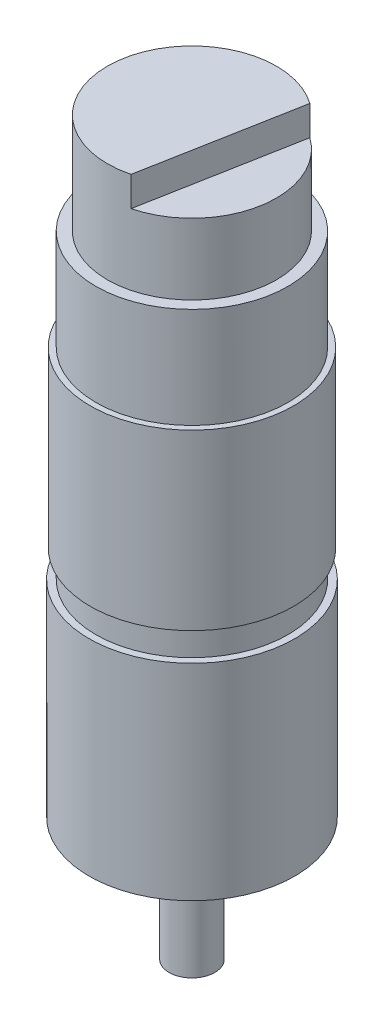
ISO-10303-21;
HEADER;
FILE_DESCRIPTION(('STEP AP214'),'2;1');
FILE_NAME('part.step','',(''),(''),'','','');
FILE_SCHEMA(('AUTOMOTIVE_DESIGN { 1 0 10303 214 1 1 1 1 }'));
ENDSEC;
DATA;
#1=APPLICATION_CONTEXT('core data for automotive mechanical design processes');
#2=APPLICATION_PROTOCOL_DEFINITION('international standard','automotive_design',2000,#1);
#3=PRODUCT_CONTEXT('',#1,'mechanical');
#4=PRODUCT('Part','Part','',(#3));
#5=PRODUCT_RELATED_PRODUCT_CATEGORY('part','',(#4));
#6=PRODUCT_DEFINITION_FORMATION('','',#4);
#7=PRODUCT_DEFINITION_CONTEXT('part definition',#1,'design');
#8=PRODUCT_DEFINITION('design','',#6,#7);
#9=PRODUCT_DEFINITION_SHAPE('','',#8);
#10=(LENGTH_UNIT() NAMED_UNIT(*) SI_UNIT(.MILLI.,.METRE.));
#11=(NAMED_UNIT(*) PLANE_ANGLE_UNIT() SI_UNIT($,.RADIAN.));
#12=(NAMED_UNIT(*) SI_UNIT($,.STERADIAN.) SOLID_ANGLE_UNIT());
#13=UNCERTAINTY_MEASURE_WITH_UNIT(LENGTH_MEASURE(1.E-05),#10,'distance_accuracy_value','');
#14=(GEOMETRIC_REPRESENTATION_CONTEXT(3) GLOBAL_UNCERTAINTY_ASSIGNED_CONTEXT((#13)) GLOBAL_UNIT_ASSIGNED_CONTEXT((#10,
#11,#12)) REPRESENTATION_CONTEXT('',''));
#15=CARTESIAN_POINT('',(0.,0.,0.));
#16=DIRECTION('',(0.,0.,1.));
#17=DIRECTION('',(1.,0.,0.));
#18=AXIS2_PLACEMENT_3D('',#15,#16,#17);
#19=CARTESIAN_POINT('',(0.,-2.,-49.6414213562373));
#20=DIRECTION('',(0.,-1.,0.));
#21=DIRECTION('',(0.,0.,-1.));
#22=AXIS2_PLACEMENT_3D('',#19,#20,#21);
#23=PLANE('',#22);
#24=DIRECTION('',(1.,0.,0.));
#25=VECTOR('',#24,1.);
#26=CARTESIAN_POINT('',(0.,-2.,-12.));
#27=LINE('',#26,#25);
#28=CARTESIAN_POINT('',(-5.00000000000001,-2.,-12.));
#29=VERTEX_POINT('',#28);
#30=CARTESIAN_POINT('',(5.00000000000001,-2.,-12.));
#31=VERTEX_POINT('',#30);
#32=EDGE_CURVE('E124',#29,#31,#27,.T.);
#33=ORIENTED_EDGE('',*,*,#32,.T.);
#34=CARTESIAN_POINT('',(0.,-2.,0.));
#35=DIRECTION('',(0.,-1.,0.));
#36=DIRECTION('',(0.,0.,-1.));
#37=AXIS2_PLACEMENT_3D('',#34,#35,#36);
#38=CIRCLE('',#37,13.);
#39=CARTESIAN_POINT('',(5.00000000000001,-2.,12.));
#40=VERTEX_POINT('',#39);
#41=EDGE_CURVE('E113',#31,#40,#38,.T.);
#42=ORIENTED_EDGE('',*,*,#41,.T.);
#43=DIRECTION('',(1.,0.,0.));
#44=VECTOR('',#43,1.);
#45=CARTESIAN_POINT('',(0.,-2.,12.));
#46=LINE('',#45,#44);
#47=CARTESIAN_POINT('',(-5.00000000000001,-2.,12.));
#48=VERTEX_POINT('',#47);
#49=EDGE_CURVE('E123',#48,#40,#46,.T.);
#50=ORIENTED_EDGE('',*,*,#49,.F.);
#51=EDGE_CURVE('E126',#48,#29,#38,.T.);
#52=ORIENTED_EDGE('',*,*,#51,.T.);
#53=EDGE_LOOP('',(#33,#42,#50,#52));
#54=FACE_BOUND('',#53,.T.);
#55=CARTESIAN_POINT('',(0.,-2.,0.));
#56=DIRECTION('',(0.,-1.,0.));
#57=DIRECTION('',(0.,0.,-1.));
#58=AXIS2_PLACEMENT_3D('',#55,#56,#57);
#59=CIRCLE('',#58,5.);
#60=CARTESIAN_POINT('',(0.,-2.,-5.));
#61=VERTEX_POINT('',#60);
#62=EDGE_CURVE('E557',#61,#61,#59,.T.);
#63=ORIENTED_EDGE('',*,*,#62,.F.);
#64=EDGE_LOOP('',(#63));
#65=FACE_BOUND('',#64,.T.);
#66=ADVANCED_FACE('F38',(#54,#65),#23,.T.);
#67=CARTESIAN_POINT('',(0.,0.,0.));
#68=DIRECTION('',(0.,1.,0.));
#69=DIRECTION('',(0.,0.,1.));
#70=AXIS2_PLACEMENT_3D('',#67,#68,#69);
#71=PLANE('',#70);
#72=CARTESIAN_POINT('',(-12.5779890005447,0.,-12.1673412339005));
#73=DIRECTION('',(0.,-1.,0.));
#74=DIRECTION('',(0.,0.,-1.));
#75=AXIS2_PLACEMENT_3D('',#72,#73,#74);
#76=CIRCLE('',#75,2.);
#77=CARTESIAN_POINT('',(-12.5779890005447,0.,-14.1673412339005));
#78=VERTEX_POINT('',#77);
#79=EDGE_CURVE('E537',#78,#78,#76,.T.);
#80=ORIENTED_EDGE('',*,*,#79,.F.);
#81=EDGE_LOOP('',(#80));
#82=FACE_BOUND('',#81,.T.);
#83=CARTESIAN_POINT('',(-12.5779890005447,0.,12.1673412339006));
#84=DIRECTION('',(0.,-1.,0.));
#85=DIRECTION('',(0.,0.,-1.));
#86=AXIS2_PLACEMENT_3D('',#83,#84,#85);
#87=CIRCLE('',#86,2.);
#88=CARTESIAN_POINT('',(-12.5779890005447,0.,10.1673412339006));
#89=VERTEX_POINT('',#88);
#90=EDGE_CURVE('E536',#89,#89,#87,.T.);
#91=ORIENTED_EDGE('',*,*,#90,.F.);
#92=EDGE_LOOP('',(#91));
#93=FACE_BOUND('',#92,.T.);
#94=CARTESIAN_POINT('',(12.5779890005447,0.,12.1673412339006));
#95=DIRECTION('',(0.,-1.,0.));
#96=DIRECTION('',(0.,0.,-1.));
#97=AXIS2_PLACEMENT_3D('',#94,#95,#96);
#98=CIRCLE('',#97,2.);
#99=CARTESIAN_POINT('',(12.5779890005447,0.,10.1673412339006));
#100=VERTEX_POINT('',#99);
#101=EDGE_CURVE('E546',#100,#100,#98,.T.);
#102=ORIENTED_EDGE('',*,*,#101,.F.);
#103=EDGE_LOOP('',(#102));
#104=FACE_BOUND('',#103,.T.);
#105=CARTESIAN_POINT('',(12.5779890005447,0.,-12.1673412339005));
#106=DIRECTION('',(0.,-1.,0.));
#107=DIRECTION('',(0.,0.,-1.));
#108=AXIS2_PLACEMENT_3D('',#105,#106,#107);
#109=CIRCLE('',#108,2.);
#110=CARTESIAN_POINT('',(12.5779890005447,0.,-14.1673412339005));
#111=VERTEX_POINT('',#110);
#112=EDGE_CURVE('E551',#111,#111,#109,.T.);
#113=ORIENTED_EDGE('',*,*,#112,.F.);
#114=EDGE_LOOP('',(#113));
#115=FACE_BOUND('',#114,.T.);
#116=CARTESIAN_POINT('',(0.,0.,0.));
#117=DIRECTION('',(0.,1.,0.));
#118=DIRECTION('',(0.,0.,1.));
#119=AXIS2_PLACEMENT_3D('',#116,#117,#118);
#120=CIRCLE('',#119,22.5);
#121=CARTESIAN_POINT('',(0.,0.,-22.5));
#122=VERTEX_POINT('',#121);
#123=EDGE_CURVE('E42',#122,#122,#120,.T.);
#124=ORIENTED_EDGE('',*,*,#123,.F.);
#125=EDGE_LOOP('',(#124));
#126=FACE_BOUND('',#125,.T.);
#127=DIRECTION('',(1.,0.,0.));
#128=VECTOR('',#127,1.);
#129=CARTESIAN_POINT('',(0.,0.,-12.));
#130=LINE('',#129,#128);
#131=CARTESIAN_POINT('',(-5.00000000000001,0.,-12.));
#132=VERTEX_POINT('',#131);
#133=CARTESIAN_POINT('',(5.00000000000001,0.,-12.));
#134=VERTEX_POINT('',#133);
#135=EDGE_CURVE('E136',#132,#134,#130,.T.);
#136=ORIENTED_EDGE('',*,*,#135,.F.);
#137=CARTESIAN_POINT('',(0.,0.,0.));
#138=DIRECTION('',(0.,-1.,0.));
#139=DIRECTION('',(0.,0.,-1.));
#140=AXIS2_PLACEMENT_3D('',#137,#138,#139);
#141=CIRCLE('',#140,13.);
#142=CARTESIAN_POINT('',(-5.00000000000001,0.,12.));
#143=VERTEX_POINT('',#142);
#144=EDGE_CURVE('E133',#143,#132,#141,.T.);
#145=ORIENTED_EDGE('',*,*,#144,.F.);
#146=DIRECTION('',(1.,0.,0.));
#147=VECTOR('',#146,1.);
#148=CARTESIAN_POINT('',(0.,0.,12.));
#149=LINE('',#148,#147);
#150=CARTESIAN_POINT('',(5.00000000000001,0.,12.));
#151=VERTEX_POINT('',#150);
#152=EDGE_CURVE('E58',#143,#151,#149,.T.);
#153=ORIENTED_EDGE('',*,*,#152,.T.);
#154=EDGE_CURVE('E53',#134,#151,#141,.T.);
#155=ORIENTED_EDGE('',*,*,#154,.F.);
#156=EDGE_LOOP('',(#136,#145,#153,#155));
#157=FACE_BOUND('',#156,.T.);
#158=ADVANCED_FACE('F217',(#82,#93,#104,#115,#126,#157),#71,.F.);
#159=CARTESIAN_POINT('',(0.,111.,0.));
#160=DIRECTION('',(0.,1.,0.));
#161=DIRECTION('',(0.,0.,1.));
#162=AXIS2_PLACEMENT_3D('',#159,#160,#161);
#163=PLANE('',#162);
#164=CARTESIAN_POINT('',(0.,111.,0.));
#165=DIRECTION('',(0.,1.,0.));
#166=DIRECTION('',(0.,0.,1.));
#167=AXIS2_PLACEMENT_3D('',#164,#165,#166);
#168=CIRCLE('',#167,21.);
#169=CARTESIAN_POINT('',(0.,111.,21.));
#170=VERTEX_POINT('',#169);
#171=EDGE_CURVE('E181',#170,#170,#168,.T.);
#172=ORIENTED_EDGE('',*,*,#171,.T.);
#173=EDGE_LOOP('',(#172));
#174=FACE_BOUND('',#173,.T.);
#175=CARTESIAN_POINT('',(0.,111.,0.));
#176=DIRECTION('',(0.,1.,0.));
#177=DIRECTION('',(0.,0.,1.));
#178=AXIS2_PLACEMENT_3D('',#175,#176,#177);
#179=CIRCLE('',#178,18.5);
#180=CARTESIAN_POINT('',(0.,111.,18.5));
#181=VERTEX_POINT('',#180);
#182=EDGE_CURVE('E173',#181,#181,#179,.T.);
#183=ORIENTED_EDGE('',*,*,#182,.F.);
#184=EDGE_LOOP('',(#183));
#185=FACE_BOUND('',#184,.T.);
#186=ADVANCED_FACE('F212',(#174,#185),#163,.T.);
#187=CARTESIAN_POINT('',(0.,89.,0.));
#188=DIRECTION('',(0.,1.,0.));
#189=DIRECTION('',(0.,0.,1.));
#190=AXIS2_PLACEMENT_3D('',#187,#188,#189);
#191=PLANE('',#190);
#192=DIRECTION('',(0.318548993490572,0.,-0.94790639767128));
#193=VECTOR('',#192,1.);
#194=CARTESIAN_POINT('',(6.68952886330199,89.,-19.9060343510969));
#195=LINE('',#194,#193);
#196=CARTESIAN_POINT('',(6.689528863302,89.,-19.9060343510969));
#197=VERTEX_POINT('',#196);
#198=CARTESIAN_POINT('',(7.08771510516521,89.,-21.090917348186));
#199=VERTEX_POINT('',#198);
#200=EDGE_CURVE('E139',#197,#199,#195,.T.);
#201=ORIENTED_EDGE('',*,*,#200,.F.);
#202=CARTESIAN_POINT('',(0.,89.,0.));
#203=DIRECTION('',(0.,1.,0.));
#204=DIRECTION('',(0.,0.,1.));
#205=AXIS2_PLACEMENT_3D('',#202,#203,#204);
#206=CIRCLE('',#205,21.);
#207=CARTESIAN_POINT('',(0.651202062164048,89.,-20.9899008066792));
#208=VERTEX_POINT('',#207);
#209=EDGE_CURVE('E178',#208,#197,#206,.T.);
#210=ORIENTED_EDGE('',*,*,#209,.F.);
#211=DIRECTION('',(-0.0310096220078119,0.,0.999519086032344));
#212=VECTOR('',#211,1.);
#213=CARTESIAN_POINT('',(0.651202062164048,89.,-20.9899008066792));
#214=LINE('',#213,#212);
#215=CARTESIAN_POINT('',(0.689964089673813,89.,-22.2392996642197));
#216=VERTEX_POINT('',#215);
#217=EDGE_CURVE('E137',#216,#208,#214,.T.);
#218=ORIENTED_EDGE('',*,*,#217,.F.);
#219=CARTESIAN_POINT('',(0.,89.,0.));
#220=DIRECTION('',(0.,1.,0.));
#221=DIRECTION('',(0.,0.,1.));
#222=AXIS2_PLACEMENT_3D('',#219,#220,#221);
#223=CIRCLE('',#222,22.25);
#224=EDGE_CURVE('E187',#216,#199,#223,.T.);
#225=ORIENTED_EDGE('',*,*,#224,.T.);
#226=EDGE_LOOP('',(#201,#210,#218,#225));
#227=FACE_BOUND('',#226,.T.);
#228=ADVANCED_FACE('F204',(#227),#191,.T.);
#229=CARTESIAN_POINT('',(0.,45.,0.));
#230=DIRECTION('',(0.,1.,0.));
#231=DIRECTION('',(0.,0.,1.));
#232=AXIS2_PLACEMENT_3D('',#229,#230,#231);
#233=PLANE('',#232);
#234=CARTESIAN_POINT('',(0.,45.,0.));
#235=DIRECTION('',(0.,1.,0.));
#236=DIRECTION('',(0.,0.,1.));
#237=AXIS2_PLACEMENT_3D('',#234,#235,#236);
#238=CIRCLE('',#237,22.5);
#239=CARTESIAN_POINT('',(0.,45.,-22.5));
#240=VERTEX_POINT('',#239);
#241=EDGE_CURVE('E11',#240,#240,#238,.T.);
#242=ORIENTED_EDGE('',*,*,#241,.T.);
#243=EDGE_LOOP('',(#242));
#244=FACE_BOUND('',#243,.T.);
#245=CARTESIAN_POINT('',(0.,45.,0.));
#246=DIRECTION('',(0.,1.,0.));
#247=DIRECTION('',(0.,0.,1.));
#248=AXIS2_PLACEMENT_3D('',#245,#246,#247);
#249=CIRCLE('',#248,21.);
#250=CARTESIAN_POINT('',(0.,45.,21.));
#251=VERTEX_POINT('',#250);
#252=EDGE_CURVE('E190',#251,#251,#249,.T.);
#253=ORIENTED_EDGE('',*,*,#252,.F.);
#254=EDGE_LOOP('',(#253));
#255=FACE_BOUND('',#254,.T.);
#256=ADVANCED_FACE('F202',(#244,#255),#233,.T.);
#257=CARTESIAN_POINT('',(0.,45.,0.));
#258=DIRECTION('',(0.,-1.,0.));
#259=DIRECTION('',(0.,0.,-1.));
#260=AXIS2_PLACEMENT_3D('',#257,#258,#259);
#261=CYLINDRICAL_SURFACE('',#260,22.5);
#262=CARTESIAN_POINT('',(0.,45.,-22.5));
#263=CARTESIAN_POINT('',(0.,44.53125,-22.5));
#264=CARTESIAN_POINT('',(0.,44.0625,-22.5));
#265=CARTESIAN_POINT('',(0.,43.125,-22.5));
#266=CARTESIAN_POINT('',(0.,42.65625,-22.5));
#267=CARTESIAN_POINT('',(0.,41.71875,-22.5));
#268=CARTESIAN_POINT('',(0.,41.25,-22.5));
#269=CARTESIAN_POINT('',(0.,40.3125,-22.5));
#270=CARTESIAN_POINT('',(0.,39.84375,-22.5));
#271=CARTESIAN_POINT('',(0.,38.90625,-22.5));
#272=CARTESIAN_POINT('',(0.,38.4375,-22.5));
#273=CARTESIAN_POINT('',(0.,37.5,-22.5));
#274=CARTESIAN_POINT('',(0.,37.03125,-22.5));
#275=CARTESIAN_POINT('',(0.,36.09375,-22.5));
#276=CARTESIAN_POINT('',(0.,35.625,-22.5));
#277=CARTESIAN_POINT('',(0.,34.6875,-22.5));
#278=CARTESIAN_POINT('',(0.,34.21875,-22.5));
#279=CARTESIAN_POINT('',(0.,33.28125,-22.5));
#280=CARTESIAN_POINT('',(0.,32.8125,-22.5));
#281=CARTESIAN_POINT('',(0.,31.875,-22.5));
#282=CARTESIAN_POINT('',(0.,31.40625,-22.5));
#283=CARTESIAN_POINT('',(0.,30.46875,-22.5));
#284=CARTESIAN_POINT('',(0.,30.,-22.5));
#285=CARTESIAN_POINT('',(0.,29.0625,-22.5));
#286=CARTESIAN_POINT('',(0.,28.59375,-22.5));
#287=CARTESIAN_POINT('',(0.,27.65625,-22.5));
#288=CARTESIAN_POINT('',(0.,27.1875,-22.5));
#289=CARTESIAN_POINT('',(0.,26.25,-22.5));
#290=CARTESIAN_POINT('',(0.,25.78125,-22.5));
#291=CARTESIAN_POINT('',(0.,24.84375,-22.5));
#292=CARTESIAN_POINT('',(0.,24.375,-22.5));
#293=CARTESIAN_POINT('',(0.,23.4375,-22.5));
#294=CARTESIAN_POINT('',(0.,22.96875,-22.5));
#295=CARTESIAN_POINT('',(0.,22.03125,-22.5));
#296=CARTESIAN_POINT('',(0.,21.5625,-22.5));
#297=CARTESIAN_POINT('',(0.,20.625,-22.5));
#298=CARTESIAN_POINT('',(0.,20.15625,-22.5));
#299=CARTESIAN_POINT('',(0.,19.21875,-22.5));
#300=CARTESIAN_POINT('',(0.,18.75,-22.5));
#301=CARTESIAN_POINT('',(0.,17.8125,-22.5));
#302=CARTESIAN_POINT('',(0.,17.34375,-22.5));
#303=CARTESIAN_POINT('',(0.,16.40625,-22.5));
#304=CARTESIAN_POINT('',(0.,15.9375,-22.5));
#305=CARTESIAN_POINT('',(0.,15.,-22.5));
#306=CARTESIAN_POINT('',(0.,14.53125,-22.5));
#307=CARTESIAN_POINT('',(0.,13.59375,-22.5));
#308=CARTESIAN_POINT('',(0.,13.125,-22.5));
#309=CARTESIAN_POINT('',(0.,12.1875,-22.5));
#310=CARTESIAN_POINT('',(0.,11.71875,-22.5));
#311=CARTESIAN_POINT('',(0.,10.78125,-22.5));
#312=CARTESIAN_POINT('',(0.,10.3125,-22.5));
#313=CARTESIAN_POINT('',(0.,9.375,-22.5));
#314=CARTESIAN_POINT('',(0.,8.90625,-22.5));
#315=CARTESIAN_POINT('',(0.,7.96874999999999,-22.5));
#316=CARTESIAN_POINT('',(0.,7.5,-22.5));
#317=CARTESIAN_POINT('',(0.,6.5625,-22.5));
#318=CARTESIAN_POINT('',(0.,6.09375,-22.5));
#319=CARTESIAN_POINT('',(0.,5.15625,-22.5));
#320=CARTESIAN_POINT('',(0.,4.68749999999999,-22.5));
#321=CARTESIAN_POINT('',(0.,3.74999999999999,-22.5));
#322=CARTESIAN_POINT('',(0.,3.28124999999999,-22.5));
#323=CARTESIAN_POINT('',(0.,2.34374999999999,-22.5));
#324=CARTESIAN_POINT('',(0.,1.87499999999999,-22.5));
#325=CARTESIAN_POINT('',(0.,0.937499999999992,-22.5));
#326=CARTESIAN_POINT('',(0.,0.468749999999993,-22.5));
#327=CARTESIAN_POINT('',(0.,0.,-22.5));
#328=B_SPLINE_CURVE_WITH_KNOTS('',3,(#262,#263,#264,#265,#266,#267,#268,#269,#270,#271,#272,
#273,#274,#275,#276,#277,#278,#279,#280,#281,#282,#283,#284,#285,#286,#287,#288,#289,#290,#291,
#292,#293,#294,#295,#296,#297,#298,#299,#300,#301,#302,#303,#304,#305,#306,#307,#308,#309,#310,
#311,#312,#313,#314,#315,#316,#317,#318,#319,#320,#321,#322,#323,#324,#325,#326,#327),
.UNSPECIFIED.,.F.,.F.,(4,2,2,2,2,2,2,2,2,2,2,2,2,2,2,2,2,2,2,2,2,2,2,2,2,2,2,2,2,2,2,2,4),(0.,
1.40625,2.8125,4.21875000000001,5.62500000000001,7.03125,8.4375,9.84375000000001,11.25,12.65625,
14.0625,15.46875,16.875,18.28125,19.6875,21.09375,22.5,23.90625,25.3125,26.71875,28.125,
29.53125,30.9375,32.34375,33.75,35.15625,36.5625,37.96875,39.375,40.78125,42.1875,43.59375,45.),.UNSPECIFIED.);
#329=EDGE_CURVE('BSEAM40',#240,#122,#328,.T.);
#330=ORIENTED_EDGE('',*,*,#241,.F.);
#331=ORIENTED_EDGE('',*,*,#123,.T.);
#332=ORIENTED_EDGE('',*,*,#329,.T.);
#333=ORIENTED_EDGE('',*,*,#329,.F.);
#334=EDGE_LOOP('',(#330,#332,#331,#333));
#335=FACE_BOUND('',#334,.T.);
#336=ADVANCED_FACE('F40',(#335),#261,.T.);
#337=CARTESIAN_POINT('',(0.,51.,0.));
#338=DIRECTION('',(0.,-1.,0.));
#339=DIRECTION('',(0.,0.,-1.));
#340=AXIS2_PLACEMENT_3D('',#337,#338,#339);
#341=CYLINDRICAL_SURFACE('',#340,21.);
#342=CARTESIAN_POINT('',(0.,51.,0.));
#343=DIRECTION('',(0.,1.,0.));
#344=DIRECTION('',(0.,0.,1.));
#345=AXIS2_PLACEMENT_3D('',#342,#343,#344);
#346=CIRCLE('',#345,21.);
#347=CARTESIAN_POINT('',(0.651202062164048,51.,-20.9899008066792));
#348=VERTEX_POINT('',#347);
#349=CARTESIAN_POINT('',(6.689528863302,51.,-19.9060343510969));
#350=VERTEX_POINT('',#349);
#351=EDGE_CURVE('E193',#348,#350,#346,.T.);
#352=ORIENTED_EDGE('',*,*,#351,.F.);
#353=DIRECTION('',(0.,1.,0.));
#354=VECTOR('',#353,1.);
#355=CARTESIAN_POINT('',(0.651202062164048,51.,-20.9899008066792));
#356=LINE('',#355,#354);
#357=EDGE_CURVE('E159',#348,#208,#356,.T.);
#358=ORIENTED_EDGE('',*,*,#357,.T.);
#359=ORIENTED_EDGE('',*,*,#209,.T.);
#360=DIRECTION('',(0.,1.,0.));
#361=VECTOR('',#360,1.);
#362=CARTESIAN_POINT('',(6.689528863302,51.,-19.9060343510969));
#363=LINE('',#362,#361);
#364=EDGE_CURVE('E157',#350,#197,#363,.T.);
#365=ORIENTED_EDGE('',*,*,#364,.F.);
#366=EDGE_LOOP('',(#352,#358,#359,#365));
#367=FACE_BOUND('',#366,.T.);
#368=ORIENTED_EDGE('',*,*,#252,.T.);
#369=EDGE_LOOP('',(#368));
#370=FACE_BOUND('',#369,.T.);
#371=ORIENTED_EDGE('',*,*,#171,.F.);
#372=EDGE_LOOP('',(#371));
#373=FACE_BOUND('',#372,.T.);
#374=ADVANCED_FACE('F199',(#367,#370,#373),#341,.T.);
#375=CARTESIAN_POINT('',(0.,51.,0.));
#376=DIRECTION('',(0.,1.,0.));
#377=DIRECTION('',(0.,0.,1.));
#378=AXIS2_PLACEMENT_3D('',#375,#376,#377);
#379=PLANE('',#378);
#380=ORIENTED_EDGE('',*,*,#351,.T.);
#381=DIRECTION('',(0.318548993490572,0.,-0.94790639767128));
#382=VECTOR('',#381,1.);
#383=CARTESIAN_POINT('',(6.68952886330199,51.,-19.9060343510969));
#384=LINE('',#383,#382);
#385=CARTESIAN_POINT('',(7.08771510516521,51.,-21.090917348186));
#386=VERTEX_POINT('',#385);
#387=EDGE_CURVE('E148',#350,#386,#384,.T.);
#388=ORIENTED_EDGE('',*,*,#387,.T.);
#389=CARTESIAN_POINT('',(0.,51.,0.));
#390=DIRECTION('',(0.,1.,0.));
#391=DIRECTION('',(0.,0.,1.));
#392=AXIS2_PLACEMENT_3D('',#389,#390,#391);
#393=CIRCLE('',#392,22.25);
#394=CARTESIAN_POINT('',(0.689964089673813,51.,-22.2392996642197));
#395=VERTEX_POINT('',#394);
#396=EDGE_CURVE('E184',#395,#386,#393,.T.);
#397=ORIENTED_EDGE('',*,*,#396,.F.);
#398=DIRECTION('',(-0.0310096220078119,0.,0.999519086032344));
#399=VECTOR('',#398,1.);
#400=CARTESIAN_POINT('',(0.651202062164048,51.,-20.9899008066792));
#401=LINE('',#400,#399);
#402=EDGE_CURVE('E145',#395,#348,#401,.T.);
#403=ORIENTED_EDGE('',*,*,#402,.T.);
#404=EDGE_LOOP('',(#380,#388,#397,#403));
#405=FACE_BOUND('',#404,.T.);
#406=ADVANCED_FACE('F265',(#405),#379,.F.);
#407=CARTESIAN_POINT('',(0.,89.,0.));
#408=DIRECTION('',(0.,-1.,0.));
#409=DIRECTION('',(0.,0.,-1.));
#410=AXIS2_PLACEMENT_3D('',#407,#408,#409);
#411=CYLINDRICAL_SURFACE('',#410,22.25);
#412=ORIENTED_EDGE('',*,*,#396,.T.);
#413=DIRECTION('',(0.,1.,0.));
#414=VECTOR('',#413,1.);
#415=CARTESIAN_POINT('',(7.08771510516521,51.,-21.090917348186));
#416=LINE('',#415,#414);
#417=EDGE_CURVE('E153',#386,#199,#416,.T.);
#418=ORIENTED_EDGE('',*,*,#417,.T.);
#419=ORIENTED_EDGE('',*,*,#224,.F.);
#420=DIRECTION('',(0.,1.,0.));
#421=VECTOR('',#420,1.);
#422=CARTESIAN_POINT('',(0.689964089673813,51.,-22.2392996642197));
#423=LINE('',#422,#421);
#424=EDGE_CURVE('E150',#395,#216,#423,.T.);
#425=ORIENTED_EDGE('',*,*,#424,.F.);
#426=EDGE_LOOP('',(#412,#418,#419,#425));
#427=FACE_BOUND('',#426,.T.);
#428=ADVANCED_FACE('F260',(#427),#411,.T.);
#429=CARTESIAN_POINT('',(0.,133.,0.));
#430=DIRECTION('',(0.,-1.,0.));
#431=DIRECTION('',(0.,0.,-1.));
#432=AXIS2_PLACEMENT_3D('',#429,#430,#431);
#433=CYLINDRICAL_SURFACE('',#432,18.5);
#434=CARTESIAN_POINT('',(0.,133.,0.));
#435=DIRECTION('',(0.,1.,0.));
#436=DIRECTION('',(0.,0.,1.));
#437=AXIS2_PLACEMENT_3D('',#434,#435,#436);
#438=CIRCLE('',#437,18.5);
#439=CARTESIAN_POINT('',(10.7160717896275,133.,-15.0803118468933));
#440=VERTEX_POINT('',#439);
#441=CARTESIAN_POINT('',(4.5972574971831,133.,17.9196881531067));
#442=VERTEX_POINT('',#441);
#443=EDGE_CURVE('E175',#440,#442,#438,.T.);
#444=ORIENTED_EDGE('',*,*,#443,.F.);
#445=DIRECTION('',(0.,1.,0.));
#446=VECTOR('',#445,1.);
#447=CARTESIAN_POINT('',(10.7160717896275,126.5,-15.0803118468933));
#448=LINE('',#447,#446);
#449=CARTESIAN_POINT('',(10.7160717896275,126.5,-15.0803118468933));
#450=VERTEX_POINT('',#449);
#451=EDGE_CURVE('E168',#450,#440,#448,.T.);
#452=ORIENTED_EDGE('',*,*,#451,.F.);
#453=CARTESIAN_POINT('',(0.,126.5,0.));
#454=DIRECTION('',(0.,1.,0.));
#455=DIRECTION('',(0.,0.,1.));
#456=AXIS2_PLACEMENT_3D('',#453,#454,#455);
#457=CIRCLE('',#456,18.5);
#458=CARTESIAN_POINT('',(4.5972574971831,126.5,17.9196881531067));
#459=VERTEX_POINT('',#458);
#460=EDGE_CURVE('E163',#459,#450,#457,.T.);
#461=ORIENTED_EDGE('',*,*,#460,.F.);
#462=DIRECTION('',(0.,1.,0.));
#463=VECTOR('',#462,1.);
#464=CARTESIAN_POINT('',(4.5972574971831,126.5,17.9196881531067));
#465=LINE('',#464,#463);
#466=EDGE_CURVE('E170',#459,#442,#465,.T.);
#467=ORIENTED_EDGE('',*,*,#466,.T.);
#468=EDGE_LOOP('',(#444,#452,#461,#467));
#469=FACE_BOUND('',#468,.T.);
#470=ORIENTED_EDGE('',*,*,#182,.T.);
#471=EDGE_LOOP('',(#470));
#472=FACE_BOUND('',#471,.T.);
#473=ADVANCED_FACE('F256',(#469,#472),#433,.T.);
#474=CARTESIAN_POINT('',(0.,133.,0.));
#475=DIRECTION('',(0.,1.,0.));
#476=DIRECTION('',(0.,0.,1.));
#477=AXIS2_PLACEMENT_3D('',#474,#475,#476);
#478=PLANE('',#477);
#479=DIRECTION('',(-0.182311163204976,0.,0.983240885933274));
#480=VECTOR('',#479,1.);
#481=CARTESIAN_POINT('',(10.7160717896275,133.,-15.0803118468933));
#482=LINE('',#481,#480);
#483=EDGE_CURVE('E156',#440,#442,#482,.T.);
#484=ORIENTED_EDGE('',*,*,#483,.F.);
#485=ORIENTED_EDGE('',*,*,#443,.T.);
#486=EDGE_LOOP('',(#484,#485));
#487=FACE_BOUND('',#486,.T.);
#488=ADVANCED_FACE('F252',(#487),#478,.T.);
#489=CARTESIAN_POINT('',(10.7160717896275,126.5,-15.0803118468933));
#490=DIRECTION('',(-0.983240885933274,0.,-0.182311163204976));
#491=DIRECTION('',(-0.182311163204976,0.,0.983240885933274));
#492=AXIS2_PLACEMENT_3D('',#489,#490,#491);
#493=PLANE('',#492);
#494=ORIENTED_EDGE('',*,*,#483,.T.);
#495=ORIENTED_EDGE('',*,*,#466,.F.);
#496=DIRECTION('',(-0.182311163204976,0.,0.983240885933274));
#497=VECTOR('',#496,1.);
#498=CARTESIAN_POINT('',(10.7160717896275,126.5,-15.0803118468933));
#499=LINE('',#498,#497);
#500=EDGE_CURVE('E165',#450,#459,#499,.T.);
#501=ORIENTED_EDGE('',*,*,#500,.F.);
#502=ORIENTED_EDGE('',*,*,#451,.T.);
#503=EDGE_LOOP('',(#494,#495,#501,#502));
#504=FACE_BOUND('',#503,.T.);
#505=ADVANCED_FACE('F248',(#504),#493,.F.);
#506=CARTESIAN_POINT('',(0.,126.5,0.));
#507=DIRECTION('',(0.,1.,0.));
#508=DIRECTION('',(0.,0.,1.));
#509=AXIS2_PLACEMENT_3D('',#506,#507,#508);
#510=PLANE('',#509);
#511=ORIENTED_EDGE('',*,*,#460,.T.);
#512=ORIENTED_EDGE('',*,*,#500,.T.);
#513=EDGE_LOOP('',(#511,#512));
#514=FACE_BOUND('',#513,.T.);
#515=ADVANCED_FACE('F241',(#514),#510,.T.);
#516=CARTESIAN_POINT('',(6.68952886330199,51.,-19.9060343510969));
#517=DIRECTION('',(0.94790639767128,0.,0.318548993490572));
#518=DIRECTION('',(0.318548993490572,0.,-0.947906397671281));
#519=AXIS2_PLACEMENT_3D('',#516,#517,#518);
#520=PLANE('',#519);
#521=ORIENTED_EDGE('',*,*,#200,.T.);
#522=ORIENTED_EDGE('',*,*,#417,.F.);
#523=ORIENTED_EDGE('',*,*,#387,.F.);
#524=ORIENTED_EDGE('',*,*,#364,.T.);
#525=EDGE_LOOP('',(#521,#522,#523,#524));
#526=FACE_BOUND('',#525,.T.);
#527=ADVANCED_FACE('F238',(#526),#520,.F.);
#528=CARTESIAN_POINT('',(0.651202062164048,51.,-20.9899008066792));
#529=DIRECTION('',(-0.999519086032344,0.,-0.0310096220078119));
#530=DIRECTION('',(-0.0310096220078119,0.,0.999519086032344));
#531=AXIS2_PLACEMENT_3D('',#528,#529,#530);
#532=PLANE('',#531);
#533=ORIENTED_EDGE('',*,*,#217,.T.);
#534=ORIENTED_EDGE('',*,*,#357,.F.);
#535=ORIENTED_EDGE('',*,*,#402,.F.);
#536=ORIENTED_EDGE('',*,*,#424,.T.);
#537=EDGE_LOOP('',(#533,#534,#535,#536));
#538=FACE_BOUND('',#537,.T.);
#539=ADVANCED_FACE('F237',(#538),#532,.F.);
#540=CARTESIAN_POINT('',(0.,-2.,-12.));
#541=DIRECTION('',(0.,0.,1.));
#542=DIRECTION('',(1.,0.,0.));
#543=AXIS2_PLACEMENT_3D('',#540,#541,#542);
#544=PLANE('',#543);
#545=ORIENTED_EDGE('',*,*,#135,.T.);
#546=DIRECTION('',(0.,1.,0.));
#547=VECTOR('',#546,1.);
#548=CARTESIAN_POINT('',(5.00000000000001,-2.,-12.));
#549=LINE('',#548,#547);
#550=EDGE_CURVE('E117',#31,#134,#549,.T.);
#551=ORIENTED_EDGE('',*,*,#550,.F.);
#552=ORIENTED_EDGE('',*,*,#32,.F.);
#553=DIRECTION('',(0.,1.,0.));
#554=VECTOR('',#553,1.);
#555=CARTESIAN_POINT('',(-5.00000000000001,-2.,-12.));
#556=LINE('',#555,#554);
#557=EDGE_CURVE('E569',#29,#132,#556,.T.);
#558=ORIENTED_EDGE('',*,*,#557,.T.);
#559=EDGE_LOOP('',(#545,#551,#552,#558));
#560=FACE_BOUND('',#559,.T.);
#561=ADVANCED_FACE('F135',(#560),#544,.F.);
#562=CARTESIAN_POINT('',(0.,-2.,0.));
#563=DIRECTION('',(0.,1.,0.));
#564=DIRECTION('',(0.,0.,1.));
#565=AXIS2_PLACEMENT_3D('',#562,#563,#564);
#566=CYLINDRICAL_SURFACE('',#565,13.);
#567=ORIENTED_EDGE('',*,*,#154,.T.);
#568=DIRECTION('',(0.,1.,0.));
#569=VECTOR('',#568,1.);
#570=CARTESIAN_POINT('',(5.00000000000001,-2.,12.));
#571=LINE('',#570,#569);
#572=EDGE_CURVE('E119',#40,#151,#571,.T.);
#573=ORIENTED_EDGE('',*,*,#572,.F.);
#574=ORIENTED_EDGE('',*,*,#41,.F.);
#575=ORIENTED_EDGE('',*,*,#550,.T.);
#576=EDGE_LOOP('',(#567,#573,#574,#575));
#577=FACE_BOUND('',#576,.T.);
#578=ADVANCED_FACE('F115',(#577),#566,.T.);
#579=CARTESIAN_POINT('',(0.,-2.,12.));
#580=DIRECTION('',(0.,0.,1.));
#581=DIRECTION('',(1.,0.,0.));
#582=AXIS2_PLACEMENT_3D('',#579,#580,#581);
#583=PLANE('',#582);
#584=ORIENTED_EDGE('',*,*,#152,.F.);
#585=DIRECTION('',(0.,1.,0.));
#586=VECTOR('',#585,1.);
#587=CARTESIAN_POINT('',(-5.00000000000001,-2.,12.));
#588=LINE('',#587,#586);
#589=EDGE_CURVE('E141',#48,#143,#588,.T.);
#590=ORIENTED_EDGE('',*,*,#589,.F.);
#591=ORIENTED_EDGE('',*,*,#49,.T.);
#592=ORIENTED_EDGE('',*,*,#572,.T.);
#593=EDGE_LOOP('',(#584,#590,#591,#592));
#594=FACE_BOUND('',#593,.T.);
#595=ADVANCED_FACE('F230',(#594),#583,.T.);
#596=ORIENTED_EDGE('',*,*,#144,.T.);
#597=ORIENTED_EDGE('',*,*,#557,.F.);
#598=ORIENTED_EDGE('',*,*,#51,.F.);
#599=ORIENTED_EDGE('',*,*,#589,.T.);
#600=EDGE_LOOP('',(#596,#597,#598,#599));
#601=FACE_BOUND('',#600,.T.);
#602=ADVANCED_FACE('F227',(#601),#566,.T.);
#603=CARTESIAN_POINT('',(0.,-27.,0.));
#604=DIRECTION('',(0.,1.,0.));
#605=DIRECTION('',(0.,0.,1.));
#606=AXIS2_PLACEMENT_3D('',#603,#604,#605);
#607=CYLINDRICAL_SURFACE('',#606,5.);
#608=CARTESIAN_POINT('',(0.,-27.,0.));
#609=DIRECTION('',(0.,-1.,0.));
#610=DIRECTION('',(0.,0.,-1.));
#611=AXIS2_PLACEMENT_3D('',#608,#609,#610);
#612=CIRCLE('',#611,5.);
#613=CARTESIAN_POINT('',(0.,-27.,-5.));
#614=VERTEX_POINT('',#613);
#615=EDGE_CURVE('E560',#614,#614,#612,.T.);
#616=ORIENTED_EDGE('',*,*,#615,.F.);
#617=EDGE_LOOP('',(#616));
#618=FACE_BOUND('',#617,.T.);
#619=ORIENTED_EDGE('',*,*,#62,.T.);
#620=EDGE_LOOP('',(#619));
#621=FACE_BOUND('',#620,.T.);
#622=ADVANCED_FACE('F225',(#618,#621),#607,.T.);
#623=CARTESIAN_POINT('',(0.,-27.,0.));
#624=DIRECTION('',(0.,-1.,0.));
#625=DIRECTION('',(0.,0.,-1.));
#626=AXIS2_PLACEMENT_3D('',#623,#624,#625);
#627=PLANE('',#626);
#628=ORIENTED_EDGE('',*,*,#615,.T.);
#629=EDGE_LOOP('',(#628));
#630=FACE_BOUND('',#629,.T.);
#631=ADVANCED_FACE('F342',(#630),#627,.T.);
#632=CARTESIAN_POINT('',(12.5779890005447,10.,-12.1673412339005));
#633=DIRECTION('',(0.,-1.,0.));
#634=DIRECTION('',(0.,0.,-1.));
#635=AXIS2_PLACEMENT_3D('',#632,#633,#634);
#636=CYLINDRICAL_SURFACE('',#635,2.);
#637=CARTESIAN_POINT('',(12.5779890005447,10.,-12.1673412339005));
#638=DIRECTION('',(0.,-1.,0.));
#639=DIRECTION('',(0.,0.,-1.));
#640=AXIS2_PLACEMENT_3D('',#637,#638,#639);
#641=CIRCLE('',#640,2.);
#642=CARTESIAN_POINT('',(12.5779890005447,10.,-14.1673412339005));
#643=VERTEX_POINT('',#642);
#644=EDGE_CURVE('E554',#643,#643,#641,.T.);
#645=ORIENTED_EDGE('',*,*,#644,.F.);
#646=EDGE_LOOP('',(#645));
#647=FACE_BOUND('',#646,.T.);
#648=ORIENTED_EDGE('',*,*,#112,.T.);
#649=EDGE_LOOP('',(#648));
#650=FACE_BOUND('',#649,.T.);
#651=ADVANCED_FACE('F350',(#647,#650),#636,.F.);
#652=CARTESIAN_POINT('',(0.,10.,-49.6414213562373));
#653=DIRECTION('',(0.,-1.,0.));
#654=DIRECTION('',(0.,0.,-1.));
#655=AXIS2_PLACEMENT_3D('',#652,#653,#654);
#656=PLANE('',#655);
#657=ORIENTED_EDGE('',*,*,#644,.T.);
#658=EDGE_LOOP('',(#657));
#659=FACE_BOUND('',#658,.T.);
#660=ADVANCED_FACE('F358',(#659),#656,.T.);
#661=CARTESIAN_POINT('',(12.5779890005447,10.,12.1673412339006));
#662=DIRECTION('',(0.,-1.,0.));
#663=DIRECTION('',(0.,0.,-1.));
#664=AXIS2_PLACEMENT_3D('',#661,#662,#663);
#665=CYLINDRICAL_SURFACE('',#664,2.);
#666=CARTESIAN_POINT('',(12.5779890005447,10.,12.1673412339006));
#667=DIRECTION('',(0.,-1.,0.));
#668=DIRECTION('',(0.,0.,-1.));
#669=AXIS2_PLACEMENT_3D('',#666,#667,#668);
#670=CIRCLE('',#669,2.);
#671=CARTESIAN_POINT('',(12.5779890005447,10.,10.1673412339006));
#672=VERTEX_POINT('',#671);
#673=EDGE_CURVE('E548',#672,#672,#670,.T.);
#674=ORIENTED_EDGE('',*,*,#673,.F.);
#675=EDGE_LOOP('',(#674));
#676=FACE_BOUND('',#675,.T.);
#677=ORIENTED_EDGE('',*,*,#101,.T.);
#678=EDGE_LOOP('',(#677));
#679=FACE_BOUND('',#678,.T.);
#680=ADVANCED_FACE('F367',(#676,#679),#665,.F.);
#681=CARTESIAN_POINT('',(0.,10.,-49.6414213562373));
#682=DIRECTION('',(0.,-1.,0.));
#683=DIRECTION('',(0.,0.,-1.));
#684=AXIS2_PLACEMENT_3D('',#681,#682,#683);
#685=PLANE('',#684);
#686=ORIENTED_EDGE('',*,*,#673,.T.);
#687=EDGE_LOOP('',(#686));
#688=FACE_BOUND('',#687,.T.);
#689=ADVANCED_FACE('F374',(#688),#685,.T.);
#690=CARTESIAN_POINT('',(-12.5779890005447,10.,12.1673412339006));
#691=DIRECTION('',(0.,-1.,0.));
#692=DIRECTION('',(0.,0.,-1.));
#693=AXIS2_PLACEMENT_3D('',#690,#691,#692);
#694=CYLINDRICAL_SURFACE('',#693,2.);
#695=CARTESIAN_POINT('',(-12.5779890005447,10.,12.1673412339006));
#696=DIRECTION('',(0.,-1.,0.));
#697=DIRECTION('',(0.,0.,-1.));
#698=AXIS2_PLACEMENT_3D('',#695,#696,#697);
#699=CIRCLE('',#698,2.);
#700=CARTESIAN_POINT('',(-12.5779890005447,10.,10.1673412339006));
#701=VERTEX_POINT('',#700);
#702=EDGE_CURVE('E540',#701,#701,#699,.T.);
#703=ORIENTED_EDGE('',*,*,#702,.F.);
#704=EDGE_LOOP('',(#703));
#705=FACE_BOUND('',#704,.T.);
#706=ORIENTED_EDGE('',*,*,#90,.T.);
#707=EDGE_LOOP('',(#706));
#708=FACE_BOUND('',#707,.T.);
#709=ADVANCED_FACE('F382',(#705,#708),#694,.F.);
#710=CARTESIAN_POINT('',(0.,10.,-49.6414213562373));
#711=DIRECTION('',(0.,-1.,0.));
#712=DIRECTION('',(0.,0.,-1.));
#713=AXIS2_PLACEMENT_3D('',#710,#711,#712);
#714=PLANE('',#713);
#715=ORIENTED_EDGE('',*,*,#702,.T.);
#716=EDGE_LOOP('',(#715));
#717=FACE_BOUND('',#716,.T.);
#718=ADVANCED_FACE('F390',(#717),#714,.T.);
#719=CARTESIAN_POINT('',(-12.5779890005447,10.,-12.1673412339005));
#720=DIRECTION('',(0.,-1.,0.));
#721=DIRECTION('',(0.,0.,-1.));
#722=AXIS2_PLACEMENT_3D('',#719,#720,#721);
#723=CYLINDRICAL_SURFACE('',#722,2.);
#724=CARTESIAN_POINT('',(-12.5779890005447,10.,-12.1673412339005));
#725=DIRECTION('',(0.,-1.,0.));
#726=DIRECTION('',(0.,0.,-1.));
#727=AXIS2_PLACEMENT_3D('',#724,#725,#726);
#728=CIRCLE('',#727,2.);
#729=CARTESIAN_POINT('',(-12.5779890005447,10.,-14.1673412339005));
#730=VERTEX_POINT('',#729);
#731=EDGE_CURVE('E535',#730,#730,#728,.T.);
#732=ORIENTED_EDGE('',*,*,#731,.F.);
#733=EDGE_LOOP('',(#732));
#734=FACE_BOUND('',#733,.T.);
#735=ORIENTED_EDGE('',*,*,#79,.T.);
#736=EDGE_LOOP('',(#735));
#737=FACE_BOUND('',#736,.T.);
#738=ADVANCED_FACE('F398',(#734,#737),#723,.F.);
#739=CARTESIAN_POINT('',(0.,10.,-49.6414213562373));
#740=DIRECTION('',(0.,-1.,0.));
#741=DIRECTION('',(0.,0.,-1.));
#742=AXIS2_PLACEMENT_3D('',#739,#740,#741);
#743=PLANE('',#742);
#744=ORIENTED_EDGE('',*,*,#731,.T.);
#745=EDGE_LOOP('',(#744));
#746=FACE_BOUND('',#745,.T.);
#747=ADVANCED_FACE('F406',(#746),#743,.T.);
#748=CLOSED_SHELL('',(#66,#158,#186,#228,#256,#336,#374,#406,#428,#473,#488,#505,#515,#527,#539,
#561,#578,#595,#602,#622,#631,#651,#660,#680,#689,#709,#718,#738,#747));
#749=MANIFOLD_SOLID_BREP('B2',#748);
#750=ADVANCED_BREP_SHAPE_REPRESENTATION('',(#18,#749),#14);
#751=SHAPE_DEFINITION_REPRESENTATION(#9,#750);
ENDSEC;
END-ISO-10303-21;
